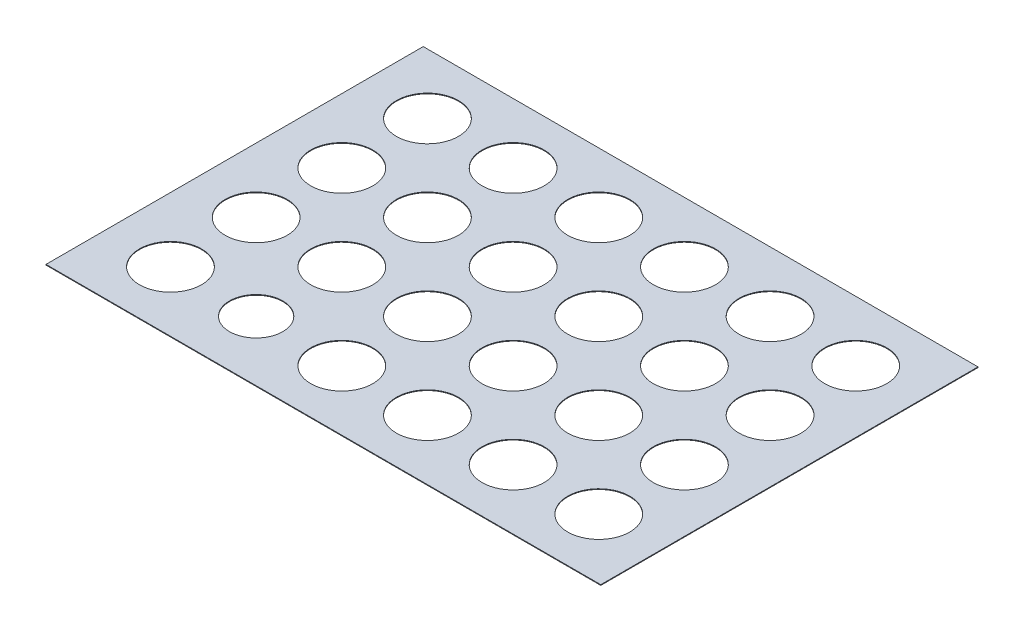
ISO-10303-21;
HEADER;
FILE_DESCRIPTION(('STEP AP214'),'2;1');
FILE_NAME('part.step','',(''),(''),'','','');
FILE_SCHEMA(('AUTOMOTIVE_DESIGN { 1 0 10303 214 1 1 1 1 }'));
ENDSEC;
DATA;
#1=APPLICATION_CONTEXT('core data for automotive mechanical design processes');
#2=APPLICATION_PROTOCOL_DEFINITION('international standard','automotive_design',2000,#1);
#3=PRODUCT_CONTEXT('',#1,'mechanical');
#4=PRODUCT('Part','Part','',(#3));
#5=PRODUCT_RELATED_PRODUCT_CATEGORY('part','',(#4));
#6=PRODUCT_DEFINITION_FORMATION('','',#4);
#7=PRODUCT_DEFINITION_CONTEXT('part definition',#1,'design');
#8=PRODUCT_DEFINITION('design','',#6,#7);
#9=PRODUCT_DEFINITION_SHAPE('','',#8);
#10=(LENGTH_UNIT() NAMED_UNIT(*) SI_UNIT(.MILLI.,.METRE.));
#11=(NAMED_UNIT(*) PLANE_ANGLE_UNIT() SI_UNIT($,.RADIAN.));
#12=(NAMED_UNIT(*) SI_UNIT($,.STERADIAN.) SOLID_ANGLE_UNIT());
#13=UNCERTAINTY_MEASURE_WITH_UNIT(LENGTH_MEASURE(1.E-05),#10,'distance_accuracy_value','');
#14=(GEOMETRIC_REPRESENTATION_CONTEXT(3) GLOBAL_UNCERTAINTY_ASSIGNED_CONTEXT((#13)) GLOBAL_UNIT_ASSIGNED_CONTEXT((#10,
#11,#12)) REPRESENTATION_CONTEXT('',''));
#15=CARTESIAN_POINT('',(0.,0.,0.));
#16=DIRECTION('',(0.,0.,1.));
#17=DIRECTION('',(1.,0.,0.));
#18=AXIS2_PLACEMENT_3D('',#15,#16,#17);
#19=CARTESIAN_POINT('',(0.,0.15,0.));
#20=DIRECTION('',(1.,0.,0.));
#21=DIRECTION('',(0.,0.,-1.));
#22=AXIS2_PLACEMENT_3D('',#19,#20,#21);
#23=PLANE('',#22);
#24=DIRECTION('',(0.,0.,1.));
#25=VECTOR('',#24,1.);
#26=CARTESIAN_POINT('',(0.,0.,0.));
#27=LINE('',#26,#25);
#28=CARTESIAN_POINT('',(0.,0.,-85.));
#29=VERTEX_POINT('',#28);
#30=CARTESIAN_POINT('',(0.,0.,0.));
#31=VERTEX_POINT('',#30);
#32=EDGE_CURVE('E95',#29,#31,#27,.T.);
#33=ORIENTED_EDGE('',*,*,#32,.T.);
#34=DIRECTION('',(0.,-1.,0.));
#35=VECTOR('',#34,1.);
#36=CARTESIAN_POINT('',(0.,0.15,0.));
#37=LINE('',#36,#35);
#38=CARTESIAN_POINT('',(0.,0.15,0.));
#39=VERTEX_POINT('',#38);
#40=EDGE_CURVE('E11',#39,#31,#37,.T.);
#41=ORIENTED_EDGE('',*,*,#40,.F.);
#42=DIRECTION('',(0.,0.,1.));
#43=VECTOR('',#42,1.);
#44=CARTESIAN_POINT('',(0.,0.15,0.));
#45=LINE('',#44,#43);
#46=CARTESIAN_POINT('',(0.,0.15,-85.));
#47=VERTEX_POINT('',#46);
#48=EDGE_CURVE('E83',#47,#39,#45,.T.);
#49=ORIENTED_EDGE('',*,*,#48,.F.);
#50=DIRECTION('',(0.,-1.,0.));
#51=VECTOR('',#50,1.);
#52=CARTESIAN_POINT('',(0.,0.15,-85.));
#53=LINE('',#52,#51);
#54=EDGE_CURVE('E91',#47,#29,#53,.T.);
#55=ORIENTED_EDGE('',*,*,#54,.T.);
#56=EDGE_LOOP('',(#33,#41,#49,#55));
#57=FACE_BOUND('',#56,.T.);
#58=ADVANCED_FACE('F32',(#57),#23,.F.);
#59=CARTESIAN_POINT('',(0.,0.15,0.));
#60=DIRECTION('',(0.,0.,-1.));
#61=DIRECTION('',(-1.,0.,0.));
#62=AXIS2_PLACEMENT_3D('',#59,#60,#61);
#63=PLANE('',#62);
#64=DIRECTION('',(1.,0.,0.));
#65=VECTOR('',#64,1.);
#66=CARTESIAN_POINT('',(0.,0.,0.));
#67=LINE('',#66,#65);
#68=CARTESIAN_POINT('',(125.,0.,0.));
#69=VERTEX_POINT('',#68);
#70=EDGE_CURVE('E87',#31,#69,#67,.T.);
#71=ORIENTED_EDGE('',*,*,#70,.T.);
#72=DIRECTION('',(0.,-1.,0.));
#73=VECTOR('',#72,1.);
#74=CARTESIAN_POINT('',(125.,0.15,0.));
#75=LINE('',#74,#73);
#76=CARTESIAN_POINT('',(125.,0.15,0.));
#77=VERTEX_POINT('',#76);
#78=EDGE_CURVE('E40',#77,#69,#75,.T.);
#79=ORIENTED_EDGE('',*,*,#78,.F.);
#80=DIRECTION('',(1.,0.,0.));
#81=VECTOR('',#80,1.);
#82=CARTESIAN_POINT('',(0.,0.15,0.));
#83=LINE('',#82,#81);
#84=EDGE_CURVE('E78',#39,#77,#83,.T.);
#85=ORIENTED_EDGE('',*,*,#84,.F.);
#86=ORIENTED_EDGE('',*,*,#40,.T.);
#87=EDGE_LOOP('',(#71,#79,#85,#86));
#88=FACE_BOUND('',#87,.T.);
#89=ADVANCED_FACE('F86',(#88),#63,.F.);
#90=CARTESIAN_POINT('',(125.,0.15,0.));
#91=DIRECTION('',(-1.,0.,0.));
#92=DIRECTION('',(0.,0.,1.));
#93=AXIS2_PLACEMENT_3D('',#90,#91,#92);
#94=PLANE('',#93);
#95=DIRECTION('',(0.,0.,-1.));
#96=VECTOR('',#95,1.);
#97=CARTESIAN_POINT('',(125.,0.,0.));
#98=LINE('',#97,#96);
#99=CARTESIAN_POINT('',(125.,0.,-85.));
#100=VERTEX_POINT('',#99);
#101=EDGE_CURVE('E65',#69,#100,#98,.T.);
#102=ORIENTED_EDGE('',*,*,#101,.T.);
#103=DIRECTION('',(0.,-1.,0.));
#104=VECTOR('',#103,1.);
#105=CARTESIAN_POINT('',(125.,0.15,-85.));
#106=LINE('',#105,#104);
#107=CARTESIAN_POINT('',(125.,0.15,-85.));
#108=VERTEX_POINT('',#107);
#109=EDGE_CURVE('E88',#108,#100,#106,.T.);
#110=ORIENTED_EDGE('',*,*,#109,.F.);
#111=DIRECTION('',(0.,0.,-1.));
#112=VECTOR('',#111,1.);
#113=CARTESIAN_POINT('',(125.,0.15,0.));
#114=LINE('',#113,#112);
#115=EDGE_CURVE('E81',#77,#108,#114,.T.);
#116=ORIENTED_EDGE('',*,*,#115,.F.);
#117=ORIENTED_EDGE('',*,*,#78,.T.);
#118=EDGE_LOOP('',(#102,#110,#116,#117));
#119=FACE_BOUND('',#118,.T.);
#120=ADVANCED_FACE('F89',(#119),#94,.F.);
#121=CARTESIAN_POINT('',(0.,0.15,-85.));
#122=DIRECTION('',(0.,0.,1.));
#123=DIRECTION('',(1.,0.,0.));
#124=AXIS2_PLACEMENT_3D('',#121,#122,#123);
#125=PLANE('',#124);
#126=DIRECTION('',(-1.,0.,0.));
#127=VECTOR('',#126,1.);
#128=CARTESIAN_POINT('',(0.,0.,-85.));
#129=LINE('',#128,#127);
#130=EDGE_CURVE('E71',#100,#29,#129,.T.);
#131=ORIENTED_EDGE('',*,*,#130,.T.);
#132=ORIENTED_EDGE('',*,*,#54,.F.);
#133=DIRECTION('',(-1.,0.,0.));
#134=VECTOR('',#133,1.);
#135=CARTESIAN_POINT('',(0.,0.15,-85.));
#136=LINE('',#135,#134);
#137=EDGE_CURVE('E48',#108,#47,#136,.T.);
#138=ORIENTED_EDGE('',*,*,#137,.F.);
#139=ORIENTED_EDGE('',*,*,#109,.T.);
#140=EDGE_LOOP('',(#131,#132,#138,#139));
#141=FACE_BOUND('',#140,.T.);
#142=ADVANCED_FACE('F103',(#141),#125,.F.);
#143=CARTESIAN_POINT('',(0.,0.15,0.));
#144=DIRECTION('',(0.,-1.,0.));
#145=DIRECTION('',(0.,0.,-1.));
#146=AXIS2_PLACEMENT_3D('',#143,#144,#145);
#147=PLANE('',#146);
#148=CARTESIAN_POINT('',(53.1,0.15,-13.55));
#149=DIRECTION('',(0.,1.,0.));
#150=DIRECTION('',(0.,0.,1.));
#151=AXIS2_PLACEMENT_3D('',#148,#149,#150);
#152=CIRCLE('',#151,7.);
#153=CARTESIAN_POINT('',(53.1,0.15,-6.55000000000001));
#154=VERTEX_POINT('',#153);
#155=EDGE_CURVE('E247',#154,#154,#152,.T.);
#156=ORIENTED_EDGE('',*,*,#155,.F.);
#157=EDGE_LOOP('',(#156));
#158=FACE_BOUND('',#157,.T.);
#159=CARTESIAN_POINT('',(111.,0.15,-13.55));
#160=DIRECTION('',(0.,1.,0.));
#161=DIRECTION('',(0.,0.,1.));
#162=AXIS2_PLACEMENT_3D('',#159,#160,#161);
#163=CIRCLE('',#162,7.);
#164=CARTESIAN_POINT('',(111.,0.15,-6.55000000000001));
#165=VERTEX_POINT('',#164);
#166=EDGE_CURVE('E241',#165,#165,#163,.T.);
#167=ORIENTED_EDGE('',*,*,#166,.F.);
#168=EDGE_LOOP('',(#167));
#169=FACE_BOUND('',#168,.T.);
#170=CARTESIAN_POINT('',(91.7,0.15,-13.55));
#171=DIRECTION('',(0.,1.,0.));
#172=DIRECTION('',(0.,0.,1.));
#173=AXIS2_PLACEMENT_3D('',#170,#171,#172);
#174=CIRCLE('',#173,7.);
#175=CARTESIAN_POINT('',(91.7,0.15,-6.55000000000001));
#176=VERTEX_POINT('',#175);
#177=EDGE_CURVE('E235',#176,#176,#174,.T.);
#178=ORIENTED_EDGE('',*,*,#177,.F.);
#179=EDGE_LOOP('',(#178));
#180=FACE_BOUND('',#179,.T.);
#181=CARTESIAN_POINT('',(72.4,0.15,-13.55));
#182=DIRECTION('',(0.,1.,0.));
#183=DIRECTION('',(0.,0.,1.));
#184=AXIS2_PLACEMENT_3D('',#181,#182,#183);
#185=CIRCLE('',#184,7.);
#186=CARTESIAN_POINT('',(72.4,0.15,-6.55000000000001));
#187=VERTEX_POINT('',#186);
#188=EDGE_CURVE('E229',#187,#187,#185,.T.);
#189=ORIENTED_EDGE('',*,*,#188,.F.);
#190=EDGE_LOOP('',(#189));
#191=FACE_BOUND('',#190,.T.);
#192=CARTESIAN_POINT('',(33.8,0.15,-13.55));
#193=DIRECTION('',(0.,1.,0.));
#194=DIRECTION('',(0.,0.,1.));
#195=AXIS2_PLACEMENT_3D('',#192,#193,#194);
#196=CIRCLE('',#195,6.0056412617514);
#197=CARTESIAN_POINT('',(33.8,0.15,-7.54435873824861));
#198=VERTEX_POINT('',#197);
#199=EDGE_CURVE('E223',#198,#198,#196,.T.);
#200=ORIENTED_EDGE('',*,*,#199,.F.);
#201=EDGE_LOOP('',(#200));
#202=FACE_BOUND('',#201,.T.);
#203=CARTESIAN_POINT('',(111.,0.15,-32.85));
#204=DIRECTION('',(0.,1.,0.));
#205=DIRECTION('',(0.,0.,1.));
#206=AXIS2_PLACEMENT_3D('',#203,#204,#205);
#207=CIRCLE('',#206,7.);
#208=CARTESIAN_POINT('',(111.,0.15,-25.85));
#209=VERTEX_POINT('',#208);
#210=EDGE_CURVE('E217',#209,#209,#207,.T.);
#211=ORIENTED_EDGE('',*,*,#210,.F.);
#212=EDGE_LOOP('',(#211));
#213=FACE_BOUND('',#212,.T.);
#214=CARTESIAN_POINT('',(91.7,0.15,-32.85));
#215=DIRECTION('',(0.,1.,0.));
#216=DIRECTION('',(0.,0.,1.));
#217=AXIS2_PLACEMENT_3D('',#214,#215,#216);
#218=CIRCLE('',#217,7.);
#219=CARTESIAN_POINT('',(91.7,0.15,-25.85));
#220=VERTEX_POINT('',#219);
#221=EDGE_CURVE('E211',#220,#220,#218,.T.);
#222=ORIENTED_EDGE('',*,*,#221,.F.);
#223=EDGE_LOOP('',(#222));
#224=FACE_BOUND('',#223,.T.);
#225=CARTESIAN_POINT('',(72.4,0.15,-32.85));
#226=DIRECTION('',(0.,1.,0.));
#227=DIRECTION('',(0.,0.,1.));
#228=AXIS2_PLACEMENT_3D('',#225,#226,#227);
#229=CIRCLE('',#228,7.);
#230=CARTESIAN_POINT('',(72.4,0.15,-25.85));
#231=VERTEX_POINT('',#230);
#232=EDGE_CURVE('E205',#231,#231,#229,.T.);
#233=ORIENTED_EDGE('',*,*,#232,.F.);
#234=EDGE_LOOP('',(#233));
#235=FACE_BOUND('',#234,.T.);
#236=CARTESIAN_POINT('',(111.,0.15,-52.15));
#237=DIRECTION('',(0.,1.,0.));
#238=DIRECTION('',(0.,0.,1.));
#239=AXIS2_PLACEMENT_3D('',#236,#237,#238);
#240=CIRCLE('',#239,7.);
#241=CARTESIAN_POINT('',(111.,0.15,-45.15));
#242=VERTEX_POINT('',#241);
#243=EDGE_CURVE('E199',#242,#242,#240,.T.);
#244=ORIENTED_EDGE('',*,*,#243,.F.);
#245=EDGE_LOOP('',(#244));
#246=FACE_BOUND('',#245,.T.);
#247=CARTESIAN_POINT('',(91.7,0.15,-52.15));
#248=DIRECTION('',(0.,1.,0.));
#249=DIRECTION('',(0.,0.,1.));
#250=AXIS2_PLACEMENT_3D('',#247,#248,#249);
#251=CIRCLE('',#250,7.);
#252=CARTESIAN_POINT('',(91.7,0.15,-45.15));
#253=VERTEX_POINT('',#252);
#254=EDGE_CURVE('E193',#253,#253,#251,.T.);
#255=ORIENTED_EDGE('',*,*,#254,.F.);
#256=EDGE_LOOP('',(#255));
#257=FACE_BOUND('',#256,.T.);
#258=CARTESIAN_POINT('',(72.4,0.15,-52.15));
#259=DIRECTION('',(0.,1.,0.));
#260=DIRECTION('',(0.,0.,1.));
#261=AXIS2_PLACEMENT_3D('',#258,#259,#260);
#262=CIRCLE('',#261,7.);
#263=CARTESIAN_POINT('',(72.4,0.15,-45.15));
#264=VERTEX_POINT('',#263);
#265=EDGE_CURVE('E187',#264,#264,#262,.T.);
#266=ORIENTED_EDGE('',*,*,#265,.F.);
#267=EDGE_LOOP('',(#266));
#268=FACE_BOUND('',#267,.T.);
#269=CARTESIAN_POINT('',(53.1,0.15,-32.85));
#270=DIRECTION('',(0.,1.,0.));
#271=DIRECTION('',(0.,0.,1.));
#272=AXIS2_PLACEMENT_3D('',#269,#270,#271);
#273=CIRCLE('',#272,7.);
#274=CARTESIAN_POINT('',(53.1,0.15,-25.85));
#275=VERTEX_POINT('',#274);
#276=EDGE_CURVE('E181',#275,#275,#273,.T.);
#277=ORIENTED_EDGE('',*,*,#276,.F.);
#278=EDGE_LOOP('',(#277));
#279=FACE_BOUND('',#278,.T.);
#280=CARTESIAN_POINT('',(53.1,0.15,-52.15));
#281=DIRECTION('',(0.,1.,0.));
#282=DIRECTION('',(0.,0.,1.));
#283=AXIS2_PLACEMENT_3D('',#280,#281,#282);
#284=CIRCLE('',#283,7.);
#285=CARTESIAN_POINT('',(53.1,0.15,-45.15));
#286=VERTEX_POINT('',#285);
#287=EDGE_CURVE('E175',#286,#286,#284,.T.);
#288=ORIENTED_EDGE('',*,*,#287,.F.);
#289=EDGE_LOOP('',(#288));
#290=FACE_BOUND('',#289,.T.);
#291=CARTESIAN_POINT('',(33.8,0.15,-32.85));
#292=DIRECTION('',(0.,1.,0.));
#293=DIRECTION('',(0.,0.,1.));
#294=AXIS2_PLACEMENT_3D('',#291,#292,#293);
#295=CIRCLE('',#294,7.);
#296=CARTESIAN_POINT('',(33.8,0.15,-25.85));
#297=VERTEX_POINT('',#296);
#298=EDGE_CURVE('E169',#297,#297,#295,.T.);
#299=ORIENTED_EDGE('',*,*,#298,.F.);
#300=EDGE_LOOP('',(#299));
#301=FACE_BOUND('',#300,.T.);
#302=CARTESIAN_POINT('',(33.8,0.15,-52.15));
#303=DIRECTION('',(0.,1.,0.));
#304=DIRECTION('',(0.,0.,1.));
#305=AXIS2_PLACEMENT_3D('',#302,#303,#304);
#306=CIRCLE('',#305,7.);
#307=CARTESIAN_POINT('',(33.8,0.15,-45.15));
#308=VERTEX_POINT('',#307);
#309=EDGE_CURVE('E163',#308,#308,#306,.T.);
#310=ORIENTED_EDGE('',*,*,#309,.F.);
#311=EDGE_LOOP('',(#310));
#312=FACE_BOUND('',#311,.T.);
#313=CARTESIAN_POINT('',(111.,0.15,-71.45));
#314=DIRECTION('',(0.,1.,0.));
#315=DIRECTION('',(0.,0.,1.));
#316=AXIS2_PLACEMENT_3D('',#313,#314,#315);
#317=CIRCLE('',#316,7.);
#318=CARTESIAN_POINT('',(111.,0.15,-64.45));
#319=VERTEX_POINT('',#318);
#320=EDGE_CURVE('E157',#319,#319,#317,.T.);
#321=ORIENTED_EDGE('',*,*,#320,.F.);
#322=EDGE_LOOP('',(#321));
#323=FACE_BOUND('',#322,.T.);
#324=CARTESIAN_POINT('',(91.7,0.15,-71.45));
#325=DIRECTION('',(0.,1.,0.));
#326=DIRECTION('',(0.,0.,1.));
#327=AXIS2_PLACEMENT_3D('',#324,#325,#326);
#328=CIRCLE('',#327,7.);
#329=CARTESIAN_POINT('',(91.7,0.15,-64.45));
#330=VERTEX_POINT('',#329);
#331=EDGE_CURVE('E151',#330,#330,#328,.T.);
#332=ORIENTED_EDGE('',*,*,#331,.F.);
#333=EDGE_LOOP('',(#332));
#334=FACE_BOUND('',#333,.T.);
#335=CARTESIAN_POINT('',(72.4,0.15,-71.45));
#336=DIRECTION('',(0.,1.,0.));
#337=DIRECTION('',(0.,0.,1.));
#338=AXIS2_PLACEMENT_3D('',#335,#336,#337);
#339=CIRCLE('',#338,7.);
#340=CARTESIAN_POINT('',(72.4,0.15,-64.45));
#341=VERTEX_POINT('',#340);
#342=EDGE_CURVE('E145',#341,#341,#339,.T.);
#343=ORIENTED_EDGE('',*,*,#342,.F.);
#344=EDGE_LOOP('',(#343));
#345=FACE_BOUND('',#344,.T.);
#346=CARTESIAN_POINT('',(53.1,0.15,-71.45));
#347=DIRECTION('',(0.,1.,0.));
#348=DIRECTION('',(0.,0.,1.));
#349=AXIS2_PLACEMENT_3D('',#346,#347,#348);
#350=CIRCLE('',#349,7.);
#351=CARTESIAN_POINT('',(53.1,0.15,-64.45));
#352=VERTEX_POINT('',#351);
#353=EDGE_CURVE('E139',#352,#352,#350,.T.);
#354=ORIENTED_EDGE('',*,*,#353,.F.);
#355=EDGE_LOOP('',(#354));
#356=FACE_BOUND('',#355,.T.);
#357=CARTESIAN_POINT('',(33.8,0.15,-71.45));
#358=DIRECTION('',(0.,1.,0.));
#359=DIRECTION('',(0.,0.,1.));
#360=AXIS2_PLACEMENT_3D('',#357,#358,#359);
#361=CIRCLE('',#360,7.);
#362=CARTESIAN_POINT('',(33.8,0.15,-64.45));
#363=VERTEX_POINT('',#362);
#364=EDGE_CURVE('E133',#363,#363,#361,.T.);
#365=ORIENTED_EDGE('',*,*,#364,.F.);
#366=EDGE_LOOP('',(#365));
#367=FACE_BOUND('',#366,.T.);
#368=CARTESIAN_POINT('',(14.5,0.15,-71.45));
#369=DIRECTION('',(0.,1.,0.));
#370=DIRECTION('',(0.,0.,1.));
#371=AXIS2_PLACEMENT_3D('',#368,#369,#370);
#372=CIRCLE('',#371,7.);
#373=CARTESIAN_POINT('',(14.5,0.15,-64.45));
#374=VERTEX_POINT('',#373);
#375=EDGE_CURVE('E127',#374,#374,#372,.T.);
#376=ORIENTED_EDGE('',*,*,#375,.F.);
#377=EDGE_LOOP('',(#376));
#378=FACE_BOUND('',#377,.T.);
#379=CARTESIAN_POINT('',(14.5,0.15,-52.15));
#380=DIRECTION('',(0.,1.,0.));
#381=DIRECTION('',(0.,0.,1.));
#382=AXIS2_PLACEMENT_3D('',#379,#380,#381);
#383=CIRCLE('',#382,7.);
#384=CARTESIAN_POINT('',(14.5,0.15,-45.15));
#385=VERTEX_POINT('',#384);
#386=EDGE_CURVE('E121',#385,#385,#383,.T.);
#387=ORIENTED_EDGE('',*,*,#386,.F.);
#388=EDGE_LOOP('',(#387));
#389=FACE_BOUND('',#388,.T.);
#390=CARTESIAN_POINT('',(14.5,0.15,-32.85));
#391=DIRECTION('',(0.,1.,0.));
#392=DIRECTION('',(0.,0.,1.));
#393=AXIS2_PLACEMENT_3D('',#390,#391,#392);
#394=CIRCLE('',#393,7.);
#395=CARTESIAN_POINT('',(14.5,0.15,-25.85));
#396=VERTEX_POINT('',#395);
#397=EDGE_CURVE('E115',#396,#396,#394,.T.);
#398=ORIENTED_EDGE('',*,*,#397,.F.);
#399=EDGE_LOOP('',(#398));
#400=FACE_BOUND('',#399,.T.);
#401=CARTESIAN_POINT('',(14.5,0.15,-13.55));
#402=DIRECTION('',(0.,1.,0.));
#403=DIRECTION('',(0.,0.,1.));
#404=AXIS2_PLACEMENT_3D('',#401,#402,#403);
#405=CIRCLE('',#404,7.);
#406=CARTESIAN_POINT('',(14.5,0.15,-6.55));
#407=VERTEX_POINT('',#406);
#408=EDGE_CURVE('E109',#407,#407,#405,.T.);
#409=ORIENTED_EDGE('',*,*,#408,.F.);
#410=EDGE_LOOP('',(#409));
#411=FACE_BOUND('',#410,.T.);
#412=ORIENTED_EDGE('',*,*,#48,.T.);
#413=ORIENTED_EDGE('',*,*,#84,.T.);
#414=ORIENTED_EDGE('',*,*,#115,.T.);
#415=ORIENTED_EDGE('',*,*,#137,.T.);
#416=EDGE_LOOP('',(#412,#413,#414,#415));
#417=FACE_BOUND('',#416,.T.);
#418=ADVANCED_FACE('F79',(#158,#169,#180,#191,#202,#213,#224,#235,#246,#257,#268,#279,#290,#301,
#312,#323,#334,#345,#356,#367,#378,#389,#400,#411,#417),#147,.F.);
#419=CARTESIAN_POINT('',(0.,0.,0.));
#420=DIRECTION('',(0.,-1.,0.));
#421=DIRECTION('',(0.,0.,-1.));
#422=AXIS2_PLACEMENT_3D('',#419,#420,#421);
#423=PLANE('',#422);
#424=CARTESIAN_POINT('',(53.1,0.,-13.55));
#425=DIRECTION('',(0.,1.,0.));
#426=DIRECTION('',(0.,0.,1.));
#427=AXIS2_PLACEMENT_3D('',#424,#425,#426);
#428=CIRCLE('',#427,7.);
#429=CARTESIAN_POINT('',(53.1,0.,-6.55000000000001));
#430=VERTEX_POINT('',#429);
#431=EDGE_CURVE('E244',#430,#430,#428,.T.);
#432=ORIENTED_EDGE('',*,*,#431,.T.);
#433=EDGE_LOOP('',(#432));
#434=FACE_BOUND('',#433,.T.);
#435=CARTESIAN_POINT('',(111.,0.,-13.55));
#436=DIRECTION('',(0.,1.,0.));
#437=DIRECTION('',(0.,0.,1.));
#438=AXIS2_PLACEMENT_3D('',#435,#436,#437);
#439=CIRCLE('',#438,7.);
#440=CARTESIAN_POINT('',(111.,0.,-6.55000000000001));
#441=VERTEX_POINT('',#440);
#442=EDGE_CURVE('E238',#441,#441,#439,.T.);
#443=ORIENTED_EDGE('',*,*,#442,.T.);
#444=EDGE_LOOP('',(#443));
#445=FACE_BOUND('',#444,.T.);
#446=CARTESIAN_POINT('',(91.7,0.,-13.55));
#447=DIRECTION('',(0.,1.,0.));
#448=DIRECTION('',(0.,0.,1.));
#449=AXIS2_PLACEMENT_3D('',#446,#447,#448);
#450=CIRCLE('',#449,7.);
#451=CARTESIAN_POINT('',(91.7,0.,-6.55000000000001));
#452=VERTEX_POINT('',#451);
#453=EDGE_CURVE('E232',#452,#452,#450,.T.);
#454=ORIENTED_EDGE('',*,*,#453,.T.);
#455=EDGE_LOOP('',(#454));
#456=FACE_BOUND('',#455,.T.);
#457=CARTESIAN_POINT('',(72.4,0.,-13.55));
#458=DIRECTION('',(0.,1.,0.));
#459=DIRECTION('',(0.,0.,1.));
#460=AXIS2_PLACEMENT_3D('',#457,#458,#459);
#461=CIRCLE('',#460,7.);
#462=CARTESIAN_POINT('',(72.4,0.,-6.55000000000001));
#463=VERTEX_POINT('',#462);
#464=EDGE_CURVE('E226',#463,#463,#461,.T.);
#465=ORIENTED_EDGE('',*,*,#464,.T.);
#466=EDGE_LOOP('',(#465));
#467=FACE_BOUND('',#466,.T.);
#468=CARTESIAN_POINT('',(33.8,0.,-13.55));
#469=DIRECTION('',(0.,1.,0.));
#470=DIRECTION('',(0.,0.,1.));
#471=AXIS2_PLACEMENT_3D('',#468,#469,#470);
#472=CIRCLE('',#471,6.0056412617514);
#473=CARTESIAN_POINT('',(33.8,0.,-7.54435873824861));
#474=VERTEX_POINT('',#473);
#475=EDGE_CURVE('E220',#474,#474,#472,.T.);
#476=ORIENTED_EDGE('',*,*,#475,.T.);
#477=EDGE_LOOP('',(#476));
#478=FACE_BOUND('',#477,.T.);
#479=CARTESIAN_POINT('',(111.,0.,-32.85));
#480=DIRECTION('',(0.,1.,0.));
#481=DIRECTION('',(0.,0.,1.));
#482=AXIS2_PLACEMENT_3D('',#479,#480,#481);
#483=CIRCLE('',#482,7.);
#484=CARTESIAN_POINT('',(111.,0.,-25.85));
#485=VERTEX_POINT('',#484);
#486=EDGE_CURVE('E214',#485,#485,#483,.T.);
#487=ORIENTED_EDGE('',*,*,#486,.T.);
#488=EDGE_LOOP('',(#487));
#489=FACE_BOUND('',#488,.T.);
#490=CARTESIAN_POINT('',(91.7,0.,-32.85));
#491=DIRECTION('',(0.,1.,0.));
#492=DIRECTION('',(0.,0.,1.));
#493=AXIS2_PLACEMENT_3D('',#490,#491,#492);
#494=CIRCLE('',#493,7.);
#495=CARTESIAN_POINT('',(91.7,0.,-25.85));
#496=VERTEX_POINT('',#495);
#497=EDGE_CURVE('E208',#496,#496,#494,.T.);
#498=ORIENTED_EDGE('',*,*,#497,.T.);
#499=EDGE_LOOP('',(#498));
#500=FACE_BOUND('',#499,.T.);
#501=CARTESIAN_POINT('',(72.4,0.,-32.85));
#502=DIRECTION('',(0.,1.,0.));
#503=DIRECTION('',(0.,0.,1.));
#504=AXIS2_PLACEMENT_3D('',#501,#502,#503);
#505=CIRCLE('',#504,7.);
#506=CARTESIAN_POINT('',(72.4,0.,-25.85));
#507=VERTEX_POINT('',#506);
#508=EDGE_CURVE('E202',#507,#507,#505,.T.);
#509=ORIENTED_EDGE('',*,*,#508,.T.);
#510=EDGE_LOOP('',(#509));
#511=FACE_BOUND('',#510,.T.);
#512=CARTESIAN_POINT('',(111.,0.,-52.15));
#513=DIRECTION('',(0.,1.,0.));
#514=DIRECTION('',(0.,0.,1.));
#515=AXIS2_PLACEMENT_3D('',#512,#513,#514);
#516=CIRCLE('',#515,7.);
#517=CARTESIAN_POINT('',(111.,0.,-45.15));
#518=VERTEX_POINT('',#517);
#519=EDGE_CURVE('E196',#518,#518,#516,.T.);
#520=ORIENTED_EDGE('',*,*,#519,.T.);
#521=EDGE_LOOP('',(#520));
#522=FACE_BOUND('',#521,.T.);
#523=CARTESIAN_POINT('',(91.7,0.,-52.15));
#524=DIRECTION('',(0.,1.,0.));
#525=DIRECTION('',(0.,0.,1.));
#526=AXIS2_PLACEMENT_3D('',#523,#524,#525);
#527=CIRCLE('',#526,7.);
#528=CARTESIAN_POINT('',(91.7,0.,-45.15));
#529=VERTEX_POINT('',#528);
#530=EDGE_CURVE('E190',#529,#529,#527,.T.);
#531=ORIENTED_EDGE('',*,*,#530,.T.);
#532=EDGE_LOOP('',(#531));
#533=FACE_BOUND('',#532,.T.);
#534=CARTESIAN_POINT('',(72.4,0.,-52.15));
#535=DIRECTION('',(0.,1.,0.));
#536=DIRECTION('',(0.,0.,1.));
#537=AXIS2_PLACEMENT_3D('',#534,#535,#536);
#538=CIRCLE('',#537,7.);
#539=CARTESIAN_POINT('',(72.4,0.,-45.15));
#540=VERTEX_POINT('',#539);
#541=EDGE_CURVE('E184',#540,#540,#538,.T.);
#542=ORIENTED_EDGE('',*,*,#541,.T.);
#543=EDGE_LOOP('',(#542));
#544=FACE_BOUND('',#543,.T.);
#545=CARTESIAN_POINT('',(53.1,0.,-32.85));
#546=DIRECTION('',(0.,1.,0.));
#547=DIRECTION('',(0.,0.,1.));
#548=AXIS2_PLACEMENT_3D('',#545,#546,#547);
#549=CIRCLE('',#548,7.);
#550=CARTESIAN_POINT('',(53.1,0.,-25.85));
#551=VERTEX_POINT('',#550);
#552=EDGE_CURVE('E178',#551,#551,#549,.T.);
#553=ORIENTED_EDGE('',*,*,#552,.T.);
#554=EDGE_LOOP('',(#553));
#555=FACE_BOUND('',#554,.T.);
#556=CARTESIAN_POINT('',(53.1,0.,-52.15));
#557=DIRECTION('',(0.,1.,0.));
#558=DIRECTION('',(0.,0.,1.));
#559=AXIS2_PLACEMENT_3D('',#556,#557,#558);
#560=CIRCLE('',#559,7.);
#561=CARTESIAN_POINT('',(53.1,0.,-45.15));
#562=VERTEX_POINT('',#561);
#563=EDGE_CURVE('E172',#562,#562,#560,.T.);
#564=ORIENTED_EDGE('',*,*,#563,.T.);
#565=EDGE_LOOP('',(#564));
#566=FACE_BOUND('',#565,.T.);
#567=CARTESIAN_POINT('',(33.8,0.,-32.85));
#568=DIRECTION('',(0.,1.,0.));
#569=DIRECTION('',(0.,0.,1.));
#570=AXIS2_PLACEMENT_3D('',#567,#568,#569);
#571=CIRCLE('',#570,7.);
#572=CARTESIAN_POINT('',(33.8,0.,-25.85));
#573=VERTEX_POINT('',#572);
#574=EDGE_CURVE('E166',#573,#573,#571,.T.);
#575=ORIENTED_EDGE('',*,*,#574,.T.);
#576=EDGE_LOOP('',(#575));
#577=FACE_BOUND('',#576,.T.);
#578=CARTESIAN_POINT('',(33.8,0.,-52.15));
#579=DIRECTION('',(0.,1.,0.));
#580=DIRECTION('',(0.,0.,1.));
#581=AXIS2_PLACEMENT_3D('',#578,#579,#580);
#582=CIRCLE('',#581,7.);
#583=CARTESIAN_POINT('',(33.8,0.,-45.15));
#584=VERTEX_POINT('',#583);
#585=EDGE_CURVE('E160',#584,#584,#582,.T.);
#586=ORIENTED_EDGE('',*,*,#585,.T.);
#587=EDGE_LOOP('',(#586));
#588=FACE_BOUND('',#587,.T.);
#589=CARTESIAN_POINT('',(111.,0.,-71.45));
#590=DIRECTION('',(0.,1.,0.));
#591=DIRECTION('',(0.,0.,1.));
#592=AXIS2_PLACEMENT_3D('',#589,#590,#591);
#593=CIRCLE('',#592,7.);
#594=CARTESIAN_POINT('',(111.,0.,-64.45));
#595=VERTEX_POINT('',#594);
#596=EDGE_CURVE('E154',#595,#595,#593,.T.);
#597=ORIENTED_EDGE('',*,*,#596,.T.);
#598=EDGE_LOOP('',(#597));
#599=FACE_BOUND('',#598,.T.);
#600=CARTESIAN_POINT('',(91.7,0.,-71.45));
#601=DIRECTION('',(0.,1.,0.));
#602=DIRECTION('',(0.,0.,1.));
#603=AXIS2_PLACEMENT_3D('',#600,#601,#602);
#604=CIRCLE('',#603,7.);
#605=CARTESIAN_POINT('',(91.7,0.,-64.45));
#606=VERTEX_POINT('',#605);
#607=EDGE_CURVE('E148',#606,#606,#604,.T.);
#608=ORIENTED_EDGE('',*,*,#607,.T.);
#609=EDGE_LOOP('',(#608));
#610=FACE_BOUND('',#609,.T.);
#611=CARTESIAN_POINT('',(72.4,0.,-71.45));
#612=DIRECTION('',(0.,1.,0.));
#613=DIRECTION('',(0.,0.,1.));
#614=AXIS2_PLACEMENT_3D('',#611,#612,#613);
#615=CIRCLE('',#614,7.);
#616=CARTESIAN_POINT('',(72.4,0.,-64.45));
#617=VERTEX_POINT('',#616);
#618=EDGE_CURVE('E142',#617,#617,#615,.T.);
#619=ORIENTED_EDGE('',*,*,#618,.T.);
#620=EDGE_LOOP('',(#619));
#621=FACE_BOUND('',#620,.T.);
#622=CARTESIAN_POINT('',(53.1,0.,-71.45));
#623=DIRECTION('',(0.,1.,0.));
#624=DIRECTION('',(0.,0.,1.));
#625=AXIS2_PLACEMENT_3D('',#622,#623,#624);
#626=CIRCLE('',#625,7.);
#627=CARTESIAN_POINT('',(53.1,0.,-64.45));
#628=VERTEX_POINT('',#627);
#629=EDGE_CURVE('E136',#628,#628,#626,.T.);
#630=ORIENTED_EDGE('',*,*,#629,.T.);
#631=EDGE_LOOP('',(#630));
#632=FACE_BOUND('',#631,.T.);
#633=CARTESIAN_POINT('',(33.8,0.,-71.45));
#634=DIRECTION('',(0.,1.,0.));
#635=DIRECTION('',(0.,0.,1.));
#636=AXIS2_PLACEMENT_3D('',#633,#634,#635);
#637=CIRCLE('',#636,7.);
#638=CARTESIAN_POINT('',(33.8,0.,-64.45));
#639=VERTEX_POINT('',#638);
#640=EDGE_CURVE('E130',#639,#639,#637,.T.);
#641=ORIENTED_EDGE('',*,*,#640,.T.);
#642=EDGE_LOOP('',(#641));
#643=FACE_BOUND('',#642,.T.);
#644=CARTESIAN_POINT('',(14.5,0.,-71.45));
#645=DIRECTION('',(0.,1.,0.));
#646=DIRECTION('',(0.,0.,1.));
#647=AXIS2_PLACEMENT_3D('',#644,#645,#646);
#648=CIRCLE('',#647,7.);
#649=CARTESIAN_POINT('',(14.5,0.,-64.45));
#650=VERTEX_POINT('',#649);
#651=EDGE_CURVE('E124',#650,#650,#648,.T.);
#652=ORIENTED_EDGE('',*,*,#651,.T.);
#653=EDGE_LOOP('',(#652));
#654=FACE_BOUND('',#653,.T.);
#655=CARTESIAN_POINT('',(14.5,0.,-52.15));
#656=DIRECTION('',(0.,1.,0.));
#657=DIRECTION('',(0.,0.,1.));
#658=AXIS2_PLACEMENT_3D('',#655,#656,#657);
#659=CIRCLE('',#658,7.);
#660=CARTESIAN_POINT('',(14.5,0.,-45.15));
#661=VERTEX_POINT('',#660);
#662=EDGE_CURVE('E118',#661,#661,#659,.T.);
#663=ORIENTED_EDGE('',*,*,#662,.T.);
#664=EDGE_LOOP('',(#663));
#665=FACE_BOUND('',#664,.T.);
#666=CARTESIAN_POINT('',(14.5,0.,-32.85));
#667=DIRECTION('',(0.,1.,0.));
#668=DIRECTION('',(0.,0.,1.));
#669=AXIS2_PLACEMENT_3D('',#666,#667,#668);
#670=CIRCLE('',#669,7.);
#671=CARTESIAN_POINT('',(14.5,0.,-25.85));
#672=VERTEX_POINT('',#671);
#673=EDGE_CURVE('E112',#672,#672,#670,.T.);
#674=ORIENTED_EDGE('',*,*,#673,.T.);
#675=EDGE_LOOP('',(#674));
#676=FACE_BOUND('',#675,.T.);
#677=CARTESIAN_POINT('',(14.5,0.,-13.55));
#678=DIRECTION('',(0.,1.,0.));
#679=DIRECTION('',(0.,0.,1.));
#680=AXIS2_PLACEMENT_3D('',#677,#678,#679);
#681=CIRCLE('',#680,7.);
#682=CARTESIAN_POINT('',(14.5,0.,-6.55));
#683=VERTEX_POINT('',#682);
#684=EDGE_CURVE('E98',#683,#683,#681,.T.);
#685=ORIENTED_EDGE('',*,*,#684,.T.);
#686=EDGE_LOOP('',(#685));
#687=FACE_BOUND('',#686,.T.);
#688=ORIENTED_EDGE('',*,*,#32,.F.);
#689=ORIENTED_EDGE('',*,*,#130,.F.);
#690=ORIENTED_EDGE('',*,*,#101,.F.);
#691=ORIENTED_EDGE('',*,*,#70,.F.);
#692=EDGE_LOOP('',(#688,#689,#690,#691));
#693=FACE_BOUND('',#692,.T.);
#694=ADVANCED_FACE('F106',(#434,#445,#456,#467,#478,#489,#500,#511,#522,#533,#544,#555,#566,
#577,#588,#599,#610,#621,#632,#643,#654,#665,#676,#687,#693),#423,.T.);
#695=CARTESIAN_POINT('',(14.5,0.,-13.55));
#696=DIRECTION('',(0.,1.,0.));
#697=DIRECTION('',(0.,0.,1.));
#698=AXIS2_PLACEMENT_3D('',#695,#696,#697);
#699=CYLINDRICAL_SURFACE('',#698,7.);
#700=ORIENTED_EDGE('',*,*,#684,.F.);
#701=EDGE_LOOP('',(#700));
#702=FACE_BOUND('',#701,.T.);
#703=ORIENTED_EDGE('',*,*,#408,.T.);
#704=EDGE_LOOP('',(#703));
#705=FACE_BOUND('',#704,.T.);
#706=ADVANCED_FACE('F311',(#702,#705),#699,.F.);
#707=CARTESIAN_POINT('',(14.5,0.,-32.85));
#708=DIRECTION('',(0.,1.,0.));
#709=DIRECTION('',(0.,0.,1.));
#710=AXIS2_PLACEMENT_3D('',#707,#708,#709);
#711=CYLINDRICAL_SURFACE('',#710,7.);
#712=ORIENTED_EDGE('',*,*,#673,.F.);
#713=EDGE_LOOP('',(#712));
#714=FACE_BOUND('',#713,.T.);
#715=ORIENTED_EDGE('',*,*,#397,.T.);
#716=EDGE_LOOP('',(#715));
#717=FACE_BOUND('',#716,.T.);
#718=ADVANCED_FACE('F313',(#714,#717),#711,.F.);
#719=CARTESIAN_POINT('',(14.5,0.,-52.15));
#720=DIRECTION('',(0.,1.,0.));
#721=DIRECTION('',(0.,0.,1.));
#722=AXIS2_PLACEMENT_3D('',#719,#720,#721);
#723=CYLINDRICAL_SURFACE('',#722,7.);
#724=ORIENTED_EDGE('',*,*,#662,.F.);
#725=EDGE_LOOP('',(#724));
#726=FACE_BOUND('',#725,.T.);
#727=ORIENTED_EDGE('',*,*,#386,.T.);
#728=EDGE_LOOP('',(#727));
#729=FACE_BOUND('',#728,.T.);
#730=ADVANCED_FACE('F320',(#726,#729),#723,.F.);
#731=CARTESIAN_POINT('',(14.5,0.,-71.45));
#732=DIRECTION('',(0.,1.,0.));
#733=DIRECTION('',(0.,0.,1.));
#734=AXIS2_PLACEMENT_3D('',#731,#732,#733);
#735=CYLINDRICAL_SURFACE('',#734,7.);
#736=ORIENTED_EDGE('',*,*,#651,.F.);
#737=EDGE_LOOP('',(#736));
#738=FACE_BOUND('',#737,.T.);
#739=ORIENTED_EDGE('',*,*,#375,.T.);
#740=EDGE_LOOP('',(#739));
#741=FACE_BOUND('',#740,.T.);
#742=ADVANCED_FACE('F366',(#738,#741),#735,.F.);
#743=CARTESIAN_POINT('',(33.8,0.,-71.45));
#744=DIRECTION('',(0.,1.,0.));
#745=DIRECTION('',(0.,0.,1.));
#746=AXIS2_PLACEMENT_3D('',#743,#744,#745);
#747=CYLINDRICAL_SURFACE('',#746,7.);
#748=ORIENTED_EDGE('',*,*,#640,.F.);
#749=EDGE_LOOP('',(#748));
#750=FACE_BOUND('',#749,.T.);
#751=ORIENTED_EDGE('',*,*,#364,.T.);
#752=EDGE_LOOP('',(#751));
#753=FACE_BOUND('',#752,.T.);
#754=ADVANCED_FACE('F376',(#750,#753),#747,.F.);
#755=CARTESIAN_POINT('',(53.1,0.,-71.45));
#756=DIRECTION('',(0.,1.,0.));
#757=DIRECTION('',(0.,0.,1.));
#758=AXIS2_PLACEMENT_3D('',#755,#756,#757);
#759=CYLINDRICAL_SURFACE('',#758,7.);
#760=ORIENTED_EDGE('',*,*,#629,.F.);
#761=EDGE_LOOP('',(#760));
#762=FACE_BOUND('',#761,.T.);
#763=ORIENTED_EDGE('',*,*,#353,.T.);
#764=EDGE_LOOP('',(#763));
#765=FACE_BOUND('',#764,.T.);
#766=ADVANCED_FACE('F386',(#762,#765),#759,.F.);
#767=CARTESIAN_POINT('',(72.4,0.,-71.45));
#768=DIRECTION('',(0.,1.,0.));
#769=DIRECTION('',(0.,0.,1.));
#770=AXIS2_PLACEMENT_3D('',#767,#768,#769);
#771=CYLINDRICAL_SURFACE('',#770,7.);
#772=ORIENTED_EDGE('',*,*,#618,.F.);
#773=EDGE_LOOP('',(#772));
#774=FACE_BOUND('',#773,.T.);
#775=ORIENTED_EDGE('',*,*,#342,.T.);
#776=EDGE_LOOP('',(#775));
#777=FACE_BOUND('',#776,.T.);
#778=ADVANCED_FACE('F396',(#774,#777),#771,.F.);
#779=CARTESIAN_POINT('',(91.7,0.,-71.45));
#780=DIRECTION('',(0.,1.,0.));
#781=DIRECTION('',(0.,0.,1.));
#782=AXIS2_PLACEMENT_3D('',#779,#780,#781);
#783=CYLINDRICAL_SURFACE('',#782,7.);
#784=ORIENTED_EDGE('',*,*,#607,.F.);
#785=EDGE_LOOP('',(#784));
#786=FACE_BOUND('',#785,.T.);
#787=ORIENTED_EDGE('',*,*,#331,.T.);
#788=EDGE_LOOP('',(#787));
#789=FACE_BOUND('',#788,.T.);
#790=ADVANCED_FACE('F406',(#786,#789),#783,.F.);
#791=CARTESIAN_POINT('',(111.,0.,-71.45));
#792=DIRECTION('',(0.,1.,0.));
#793=DIRECTION('',(0.,0.,1.));
#794=AXIS2_PLACEMENT_3D('',#791,#792,#793);
#795=CYLINDRICAL_SURFACE('',#794,7.);
#796=ORIENTED_EDGE('',*,*,#596,.F.);
#797=EDGE_LOOP('',(#796));
#798=FACE_BOUND('',#797,.T.);
#799=ORIENTED_EDGE('',*,*,#320,.T.);
#800=EDGE_LOOP('',(#799));
#801=FACE_BOUND('',#800,.T.);
#802=ADVANCED_FACE('F416',(#798,#801),#795,.F.);
#803=CARTESIAN_POINT('',(33.8,0.,-52.15));
#804=DIRECTION('',(0.,1.,0.));
#805=DIRECTION('',(0.,0.,1.));
#806=AXIS2_PLACEMENT_3D('',#803,#804,#805);
#807=CYLINDRICAL_SURFACE('',#806,7.);
#808=ORIENTED_EDGE('',*,*,#585,.F.);
#809=EDGE_LOOP('',(#808));
#810=FACE_BOUND('',#809,.T.);
#811=ORIENTED_EDGE('',*,*,#309,.T.);
#812=EDGE_LOOP('',(#811));
#813=FACE_BOUND('',#812,.T.);
#814=ADVANCED_FACE('F426',(#810,#813),#807,.F.);
#815=CARTESIAN_POINT('',(33.8,0.,-32.85));
#816=DIRECTION('',(0.,1.,0.));
#817=DIRECTION('',(0.,0.,1.));
#818=AXIS2_PLACEMENT_3D('',#815,#816,#817);
#819=CYLINDRICAL_SURFACE('',#818,7.);
#820=ORIENTED_EDGE('',*,*,#574,.F.);
#821=EDGE_LOOP('',(#820));
#822=FACE_BOUND('',#821,.T.);
#823=ORIENTED_EDGE('',*,*,#298,.T.);
#824=EDGE_LOOP('',(#823));
#825=FACE_BOUND('',#824,.T.);
#826=ADVANCED_FACE('F436',(#822,#825),#819,.F.);
#827=CARTESIAN_POINT('',(53.1,0.,-52.15));
#828=DIRECTION('',(0.,1.,0.));
#829=DIRECTION('',(0.,0.,1.));
#830=AXIS2_PLACEMENT_3D('',#827,#828,#829);
#831=CYLINDRICAL_SURFACE('',#830,7.);
#832=ORIENTED_EDGE('',*,*,#563,.F.);
#833=EDGE_LOOP('',(#832));
#834=FACE_BOUND('',#833,.T.);
#835=ORIENTED_EDGE('',*,*,#287,.T.);
#836=EDGE_LOOP('',(#835));
#837=FACE_BOUND('',#836,.T.);
#838=ADVANCED_FACE('F446',(#834,#837),#831,.F.);
#839=CARTESIAN_POINT('',(53.1,0.,-32.85));
#840=DIRECTION('',(0.,1.,0.));
#841=DIRECTION('',(0.,0.,1.));
#842=AXIS2_PLACEMENT_3D('',#839,#840,#841);
#843=CYLINDRICAL_SURFACE('',#842,7.);
#844=ORIENTED_EDGE('',*,*,#552,.F.);
#845=EDGE_LOOP('',(#844));
#846=FACE_BOUND('',#845,.T.);
#847=ORIENTED_EDGE('',*,*,#276,.T.);
#848=EDGE_LOOP('',(#847));
#849=FACE_BOUND('',#848,.T.);
#850=ADVANCED_FACE('F456',(#846,#849),#843,.F.);
#851=CARTESIAN_POINT('',(72.4,0.,-52.15));
#852=DIRECTION('',(0.,1.,0.));
#853=DIRECTION('',(0.,0.,1.));
#854=AXIS2_PLACEMENT_3D('',#851,#852,#853);
#855=CYLINDRICAL_SURFACE('',#854,7.);
#856=ORIENTED_EDGE('',*,*,#541,.F.);
#857=EDGE_LOOP('',(#856));
#858=FACE_BOUND('',#857,.T.);
#859=ORIENTED_EDGE('',*,*,#265,.T.);
#860=EDGE_LOOP('',(#859));
#861=FACE_BOUND('',#860,.T.);
#862=ADVANCED_FACE('F466',(#858,#861),#855,.F.);
#863=CARTESIAN_POINT('',(91.7,0.,-52.15));
#864=DIRECTION('',(0.,1.,0.));
#865=DIRECTION('',(0.,0.,1.));
#866=AXIS2_PLACEMENT_3D('',#863,#864,#865);
#867=CYLINDRICAL_SURFACE('',#866,7.);
#868=ORIENTED_EDGE('',*,*,#530,.F.);
#869=EDGE_LOOP('',(#868));
#870=FACE_BOUND('',#869,.T.);
#871=ORIENTED_EDGE('',*,*,#254,.T.);
#872=EDGE_LOOP('',(#871));
#873=FACE_BOUND('',#872,.T.);
#874=ADVANCED_FACE('F476',(#870,#873),#867,.F.);
#875=CARTESIAN_POINT('',(111.,0.,-52.15));
#876=DIRECTION('',(0.,1.,0.));
#877=DIRECTION('',(0.,0.,1.));
#878=AXIS2_PLACEMENT_3D('',#875,#876,#877);
#879=CYLINDRICAL_SURFACE('',#878,7.);
#880=ORIENTED_EDGE('',*,*,#519,.F.);
#881=EDGE_LOOP('',(#880));
#882=FACE_BOUND('',#881,.T.);
#883=ORIENTED_EDGE('',*,*,#243,.T.);
#884=EDGE_LOOP('',(#883));
#885=FACE_BOUND('',#884,.T.);
#886=ADVANCED_FACE('F486',(#882,#885),#879,.F.);
#887=CARTESIAN_POINT('',(72.4,0.,-32.85));
#888=DIRECTION('',(0.,1.,0.));
#889=DIRECTION('',(0.,0.,1.));
#890=AXIS2_PLACEMENT_3D('',#887,#888,#889);
#891=CYLINDRICAL_SURFACE('',#890,7.);
#892=ORIENTED_EDGE('',*,*,#508,.F.);
#893=EDGE_LOOP('',(#892));
#894=FACE_BOUND('',#893,.T.);
#895=ORIENTED_EDGE('',*,*,#232,.T.);
#896=EDGE_LOOP('',(#895));
#897=FACE_BOUND('',#896,.T.);
#898=ADVANCED_FACE('F496',(#894,#897),#891,.F.);
#899=CARTESIAN_POINT('',(91.7,0.,-32.85));
#900=DIRECTION('',(0.,1.,0.));
#901=DIRECTION('',(0.,0.,1.));
#902=AXIS2_PLACEMENT_3D('',#899,#900,#901);
#903=CYLINDRICAL_SURFACE('',#902,7.);
#904=ORIENTED_EDGE('',*,*,#497,.F.);
#905=EDGE_LOOP('',(#904));
#906=FACE_BOUND('',#905,.T.);
#907=ORIENTED_EDGE('',*,*,#221,.T.);
#908=EDGE_LOOP('',(#907));
#909=FACE_BOUND('',#908,.T.);
#910=ADVANCED_FACE('F506',(#906,#909),#903,.F.);
#911=CARTESIAN_POINT('',(111.,0.,-32.85));
#912=DIRECTION('',(0.,1.,0.));
#913=DIRECTION('',(0.,0.,1.));
#914=AXIS2_PLACEMENT_3D('',#911,#912,#913);
#915=CYLINDRICAL_SURFACE('',#914,7.);
#916=ORIENTED_EDGE('',*,*,#486,.F.);
#917=EDGE_LOOP('',(#916));
#918=FACE_BOUND('',#917,.T.);
#919=ORIENTED_EDGE('',*,*,#210,.T.);
#920=EDGE_LOOP('',(#919));
#921=FACE_BOUND('',#920,.T.);
#922=ADVANCED_FACE('F516',(#918,#921),#915,.F.);
#923=CARTESIAN_POINT('',(33.8,0.,-13.55));
#924=DIRECTION('',(0.,1.,0.));
#925=DIRECTION('',(0.,0.,1.));
#926=AXIS2_PLACEMENT_3D('',#923,#924,#925);
#927=CYLINDRICAL_SURFACE('',#926,6.0056412617514);
#928=ORIENTED_EDGE('',*,*,#475,.F.);
#929=EDGE_LOOP('',(#928));
#930=FACE_BOUND('',#929,.T.);
#931=ORIENTED_EDGE('',*,*,#199,.T.);
#932=EDGE_LOOP('',(#931));
#933=FACE_BOUND('',#932,.T.);
#934=ADVANCED_FACE('F526',(#930,#933),#927,.F.);
#935=CARTESIAN_POINT('',(72.4,0.,-13.55));
#936=DIRECTION('',(0.,1.,0.));
#937=DIRECTION('',(0.,0.,1.));
#938=AXIS2_PLACEMENT_3D('',#935,#936,#937);
#939=CYLINDRICAL_SURFACE('',#938,7.);
#940=ORIENTED_EDGE('',*,*,#464,.F.);
#941=EDGE_LOOP('',(#940));
#942=FACE_BOUND('',#941,.T.);
#943=ORIENTED_EDGE('',*,*,#188,.T.);
#944=EDGE_LOOP('',(#943));
#945=FACE_BOUND('',#944,.T.);
#946=ADVANCED_FACE('F536',(#942,#945),#939,.F.);
#947=CARTESIAN_POINT('',(91.7,0.,-13.55));
#948=DIRECTION('',(0.,1.,0.));
#949=DIRECTION('',(0.,0.,1.));
#950=AXIS2_PLACEMENT_3D('',#947,#948,#949);
#951=CYLINDRICAL_SURFACE('',#950,7.);
#952=ORIENTED_EDGE('',*,*,#453,.F.);
#953=EDGE_LOOP('',(#952));
#954=FACE_BOUND('',#953,.T.);
#955=ORIENTED_EDGE('',*,*,#177,.T.);
#956=EDGE_LOOP('',(#955));
#957=FACE_BOUND('',#956,.T.);
#958=ADVANCED_FACE('F546',(#954,#957),#951,.F.);
#959=CARTESIAN_POINT('',(111.,0.,-13.55));
#960=DIRECTION('',(0.,1.,0.));
#961=DIRECTION('',(0.,0.,1.));
#962=AXIS2_PLACEMENT_3D('',#959,#960,#961);
#963=CYLINDRICAL_SURFACE('',#962,7.);
#964=ORIENTED_EDGE('',*,*,#442,.F.);
#965=EDGE_LOOP('',(#964));
#966=FACE_BOUND('',#965,.T.);
#967=ORIENTED_EDGE('',*,*,#166,.T.);
#968=EDGE_LOOP('',(#967));
#969=FACE_BOUND('',#968,.T.);
#970=ADVANCED_FACE('F258',(#966,#969),#963,.F.);
#971=CARTESIAN_POINT('',(53.1,0.,-13.55));
#972=DIRECTION('',(0.,1.,0.));
#973=DIRECTION('',(0.,0.,1.));
#974=AXIS2_PLACEMENT_3D('',#971,#972,#973);
#975=CYLINDRICAL_SURFACE('',#974,7.);
#976=ORIENTED_EDGE('',*,*,#431,.F.);
#977=EDGE_LOOP('',(#976));
#978=FACE_BOUND('',#977,.T.);
#979=ORIENTED_EDGE('',*,*,#155,.T.);
#980=EDGE_LOOP('',(#979));
#981=FACE_BOUND('',#980,.T.);
#982=ADVANCED_FACE('F255',(#978,#981),#975,.F.);
#983=CLOSED_SHELL('',(#58,#89,#120,#142,#418,#694,#706,#718,#730,#742,#754,#766,#778,#790,#802,
#814,#826,#838,#850,#862,#874,#886,#898,#910,#922,#934,#946,#958,#970,#982));
#984=MANIFOLD_SOLID_BREP('B2',#983);
#985=ADVANCED_BREP_SHAPE_REPRESENTATION('',(#18,#984),#14);
#986=SHAPE_DEFINITION_REPRESENTATION(#9,#985);
ENDSEC;
END-ISO-10303-21;
